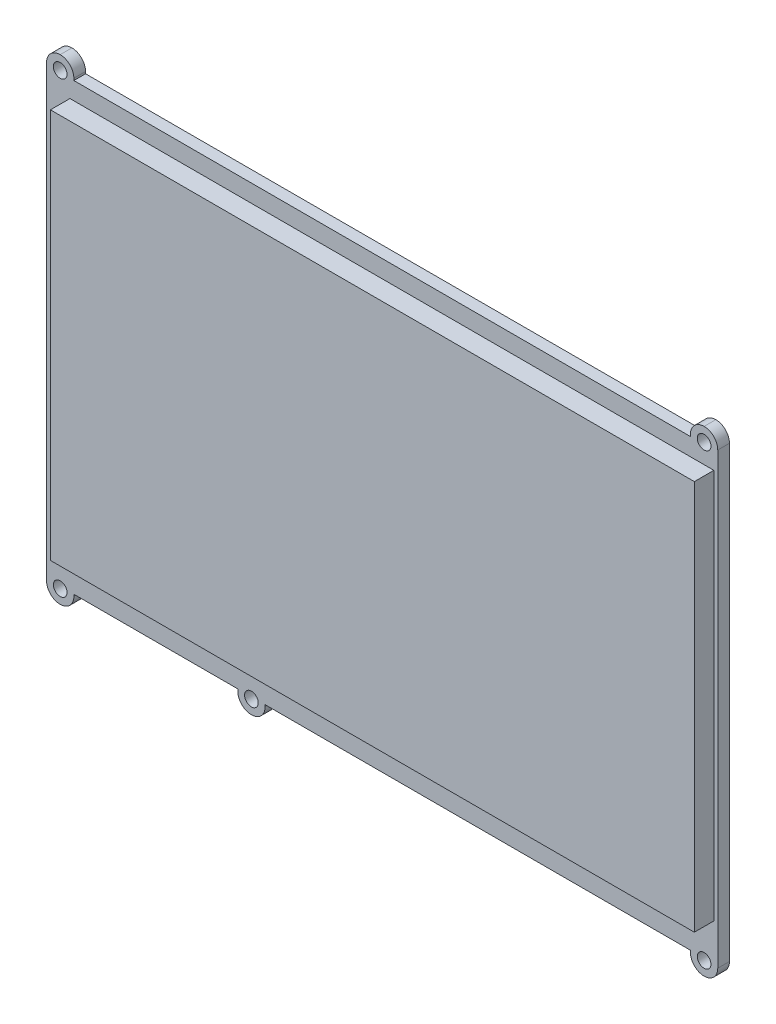
ISO-10303-21;
HEADER;
FILE_DESCRIPTION(('STEP AP214'),'2;1');
FILE_NAME('part.step','',(''),(''),'','','');
FILE_SCHEMA(('AUTOMOTIVE_DESIGN { 1 0 10303 214 1 1 1 1 }'));
ENDSEC;
DATA;
#1=APPLICATION_CONTEXT('core data for automotive mechanical design processes');
#2=APPLICATION_PROTOCOL_DEFINITION('international standard','automotive_design',2000,#1);
#3=PRODUCT_CONTEXT('',#1,'mechanical');
#4=PRODUCT('Part','Part','',(#3));
#5=PRODUCT_RELATED_PRODUCT_CATEGORY('part','',(#4));
#6=PRODUCT_DEFINITION_FORMATION('','',#4);
#7=PRODUCT_DEFINITION_CONTEXT('part definition',#1,'design');
#8=PRODUCT_DEFINITION('design','',#6,#7);
#9=PRODUCT_DEFINITION_SHAPE('','',#8);
#10=(LENGTH_UNIT() NAMED_UNIT(*) SI_UNIT(.MILLI.,.METRE.));
#11=(NAMED_UNIT(*) PLANE_ANGLE_UNIT() SI_UNIT($,.RADIAN.));
#12=(NAMED_UNIT(*) SI_UNIT($,.STERADIAN.) SOLID_ANGLE_UNIT());
#13=UNCERTAINTY_MEASURE_WITH_UNIT(LENGTH_MEASURE(1.E-05),#10,'distance_accuracy_value','');
#14=(GEOMETRIC_REPRESENTATION_CONTEXT(3) GLOBAL_UNCERTAINTY_ASSIGNED_CONTEXT((#13)) GLOBAL_UNIT_ASSIGNED_CONTEXT((#10,
#11,#12)) REPRESENTATION_CONTEXT('',''));
#15=CARTESIAN_POINT('',(0.,0.,0.));
#16=DIRECTION('',(0.,0.,1.));
#17=DIRECTION('',(1.,0.,0.));
#18=AXIS2_PLACEMENT_3D('',#15,#16,#17);
#19=CARTESIAN_POINT('',(5.99999999999999,13.5,8.));
#20=DIRECTION('',(0.,1.,0.));
#21=DIRECTION('',(-1.,0.,0.));
#22=AXIS2_PLACEMENT_3D('',#19,#20,#21);
#23=PLANE('',#22);
#24=DIRECTION('',(0.,0.,-1.));
#25=VECTOR('',#24,1.);
#26=CARTESIAN_POINT('',(5.99999999999999,13.5,8.));
#27=LINE('',#26,#25);
#28=CARTESIAN_POINT('',(5.99999999999999,13.5,8.));
#29=VERTEX_POINT('',#28);
#30=CARTESIAN_POINT('',(5.99999999999999,13.5,3.));
#31=VERTEX_POINT('',#30);
#32=EDGE_CURVE('E221',#29,#31,#27,.T.);
#33=ORIENTED_EDGE('',*,*,#32,.T.);
#34=DIRECTION('',(1.,0.,0.));
#35=VECTOR('',#34,1.);
#36=CARTESIAN_POINT('',(5.99999999999999,13.5,3.));
#37=LINE('',#36,#35);
#38=CARTESIAN_POINT('',(171.,13.5,3.));
#39=VERTEX_POINT('',#38);
#40=EDGE_CURVE('E206',#31,#39,#37,.T.);
#41=ORIENTED_EDGE('',*,*,#40,.T.);
#42=DIRECTION('',(0.,0.,-1.));
#43=VECTOR('',#42,1.);
#44=CARTESIAN_POINT('',(171.,13.5,8.));
#45=LINE('',#44,#43);
#46=CARTESIAN_POINT('',(171.,13.5,8.));
#47=VERTEX_POINT('',#46);
#48=EDGE_CURVE('E218',#47,#39,#45,.T.);
#49=ORIENTED_EDGE('',*,*,#48,.F.);
#50=DIRECTION('',(1.,0.,0.));
#51=VECTOR('',#50,1.);
#52=CARTESIAN_POINT('',(5.99999999999999,13.5,8.));
#53=LINE('',#52,#51);
#54=EDGE_CURVE('E381',#29,#47,#53,.T.);
#55=ORIENTED_EDGE('',*,*,#54,.F.);
#56=EDGE_LOOP('',(#33,#41,#49,#55));
#57=FACE_BOUND('',#56,.T.);
#58=ADVANCED_FACE('F34',(#57),#23,.F.);
#59=CARTESIAN_POINT('',(171.,113.5,8.));
#60=DIRECTION('',(1.,0.,0.));
#61=DIRECTION('',(0.,1.,0.));
#62=AXIS2_PLACEMENT_3D('',#59,#60,#61);
#63=PLANE('',#62);
#64=DIRECTION('',(0.,1.,0.));
#65=VECTOR('',#64,1.);
#66=CARTESIAN_POINT('',(171.,113.5,3.));
#67=LINE('',#66,#65);
#68=CARTESIAN_POINT('',(171.,113.5,3.));
#69=VERTEX_POINT('',#68);
#70=EDGE_CURVE('E202',#39,#69,#67,.T.);
#71=ORIENTED_EDGE('',*,*,#70,.T.);
#72=DIRECTION('',(0.,0.,-1.));
#73=VECTOR('',#72,1.);
#74=CARTESIAN_POINT('',(171.,113.5,8.));
#75=LINE('',#74,#73);
#76=CARTESIAN_POINT('',(171.,113.5,8.));
#77=VERTEX_POINT('',#76);
#78=EDGE_CURVE('E228',#77,#69,#75,.T.);
#79=ORIENTED_EDGE('',*,*,#78,.F.);
#80=DIRECTION('',(0.,-1.,0.));
#81=VECTOR('',#80,1.);
#82=CARTESIAN_POINT('',(171.,113.5,8.));
#83=LINE('',#82,#81);
#84=EDGE_CURVE('E226',#77,#47,#83,.T.);
#85=ORIENTED_EDGE('',*,*,#84,.T.);
#86=ORIENTED_EDGE('',*,*,#48,.T.);
#87=EDGE_LOOP('',(#71,#79,#85,#86));
#88=FACE_BOUND('',#87,.T.);
#89=ADVANCED_FACE('F224',(#88),#63,.T.);
#90=CARTESIAN_POINT('',(5.99999999999998,113.5,8.));
#91=DIRECTION('',(0.,1.,0.));
#92=DIRECTION('',(0.,0.,1.));
#93=AXIS2_PLACEMENT_3D('',#90,#91,#92);
#94=PLANE('',#93);
#95=DIRECTION('',(-1.,0.,0.));
#96=VECTOR('',#95,1.);
#97=CARTESIAN_POINT('',(5.99999999999998,113.5,3.));
#98=LINE('',#97,#96);
#99=CARTESIAN_POINT('',(5.99999999999998,113.5,3.));
#100=VERTEX_POINT('',#99);
#101=EDGE_CURVE('E209',#69,#100,#98,.T.);
#102=ORIENTED_EDGE('',*,*,#101,.T.);
#103=DIRECTION('',(0.,0.,-1.));
#104=VECTOR('',#103,1.);
#105=CARTESIAN_POINT('',(5.99999999999998,113.5,8.));
#106=LINE('',#105,#104);
#107=CARTESIAN_POINT('',(5.99999999999998,113.5,8.));
#108=VERTEX_POINT('',#107);
#109=EDGE_CURVE('E233',#108,#100,#106,.T.);
#110=ORIENTED_EDGE('',*,*,#109,.F.);
#111=DIRECTION('',(1.,0.,0.));
#112=VECTOR('',#111,1.);
#113=CARTESIAN_POINT('',(5.99999999999998,113.5,8.));
#114=LINE('',#113,#112);
#115=EDGE_CURVE('E384',#108,#77,#114,.T.);
#116=ORIENTED_EDGE('',*,*,#115,.T.);
#117=ORIENTED_EDGE('',*,*,#78,.T.);
#118=EDGE_LOOP('',(#102,#110,#116,#117));
#119=FACE_BOUND('',#118,.T.);
#120=ADVANCED_FACE('F395',(#119),#94,.T.);
#121=CARTESIAN_POINT('',(5.99999999999998,113.5,8.));
#122=DIRECTION('',(1.,0.,0.));
#123=DIRECTION('',(0.,1.,0.));
#124=AXIS2_PLACEMENT_3D('',#121,#122,#123);
#125=PLANE('',#124);
#126=ORIENTED_EDGE('',*,*,#109,.T.);
#127=DIRECTION('',(0.,-1.,0.));
#128=VECTOR('',#127,1.);
#129=CARTESIAN_POINT('',(5.99999999999998,113.5,3.));
#130=LINE('',#129,#128);
#131=EDGE_CURVE('E222',#100,#31,#130,.T.);
#132=ORIENTED_EDGE('',*,*,#131,.T.);
#133=ORIENTED_EDGE('',*,*,#32,.F.);
#134=DIRECTION('',(0.,-1.,0.));
#135=VECTOR('',#134,1.);
#136=CARTESIAN_POINT('',(5.99999999999998,113.5,8.));
#137=LINE('',#136,#135);
#138=EDGE_CURVE('E387',#108,#29,#137,.T.);
#139=ORIENTED_EDGE('',*,*,#138,.F.);
#140=EDGE_LOOP('',(#126,#132,#133,#139));
#141=FACE_BOUND('',#140,.T.);
#142=ADVANCED_FACE('F392',(#141),#125,.F.);
#143=CARTESIAN_POINT('',(0.,0.,8.));
#144=DIRECTION('',(0.,0.,-1.));
#145=DIRECTION('',(-1.,0.,0.));
#146=AXIS2_PLACEMENT_3D('',#143,#144,#145);
#147=PLANE('',#146);
#148=ORIENTED_EDGE('',*,*,#54,.T.);
#149=ORIENTED_EDGE('',*,*,#84,.F.);
#150=ORIENTED_EDGE('',*,*,#115,.F.);
#151=ORIENTED_EDGE('',*,*,#138,.T.);
#152=EDGE_LOOP('',(#148,#149,#150,#151));
#153=FACE_BOUND('',#152,.T.);
#154=ADVANCED_FACE('F682',(#153),#147,.F.);
#155=CARTESIAN_POINT('',(0.,0.,3.));
#156=DIRECTION('',(0.,0.,1.));
#157=DIRECTION('',(1.,0.,0.));
#158=AXIS2_PLACEMENT_3D('',#155,#156,#157);
#159=PLANE('',#158);
#160=CARTESIAN_POINT('',(52.5000000000012,3.5,3.));
#161=DIRECTION('',(0.,0.,1.));
#162=DIRECTION('',(1.,0.,0.));
#163=AXIS2_PLACEMENT_3D('',#160,#161,#162);
#164=CIRCLE('',#163,1.75);
#165=CARTESIAN_POINT('',(54.2500000000012,3.5,3.));
#166=VERTEX_POINT('',#165);
#167=EDGE_CURVE('E781',#166,#166,#164,.T.);
#168=ORIENTED_EDGE('',*,*,#167,.F.);
#169=EDGE_LOOP('',(#168));
#170=FACE_BOUND('',#169,.T.);
#171=CARTESIAN_POINT('',(168.500000000001,3.5,3.));
#172=DIRECTION('',(0.,0.,1.));
#173=DIRECTION('',(1.,0.,0.));
#174=AXIS2_PLACEMENT_3D('',#171,#172,#173);
#175=CIRCLE('',#174,1.75000000000001);
#176=CARTESIAN_POINT('',(170.250000000001,3.5,3.));
#177=VERTEX_POINT('',#176);
#178=EDGE_CURVE('E785',#177,#177,#175,.T.);
#179=ORIENTED_EDGE('',*,*,#178,.F.);
#180=EDGE_LOOP('',(#179));
#181=FACE_BOUND('',#180,.T.);
#182=CARTESIAN_POINT('',(3.5,118.5,3.));
#183=DIRECTION('',(0.,0.,1.));
#184=DIRECTION('',(1.,0.,0.));
#185=AXIS2_PLACEMENT_3D('',#182,#183,#184);
#186=CIRCLE('',#185,1.75);
#187=CARTESIAN_POINT('',(5.25,118.5,3.));
#188=VERTEX_POINT('',#187);
#189=EDGE_CURVE('E788',#188,#188,#186,.T.);
#190=ORIENTED_EDGE('',*,*,#189,.F.);
#191=EDGE_LOOP('',(#190));
#192=FACE_BOUND('',#191,.T.);
#193=DIRECTION('',(0.,-1.,0.));
#194=VECTOR('',#193,1.);
#195=CARTESIAN_POINT('',(165.,0.,3.));
#196=LINE('',#195,#194);
#197=CARTESIAN_POINT('',(165.,4.,3.));
#198=VERTEX_POINT('',#197);
#199=CARTESIAN_POINT('',(165.,3.5,3.));
#200=VERTEX_POINT('',#199);
#201=EDGE_CURVE('E333',#198,#200,#196,.T.);
#202=ORIENTED_EDGE('',*,*,#201,.T.);
#203=CARTESIAN_POINT('',(168.5,3.5,3.));
#204=DIRECTION('',(0.,0.,1.));
#205=DIRECTION('',(1.,0.,0.));
#206=AXIS2_PLACEMENT_3D('',#203,#204,#205);
#207=CIRCLE('',#206,3.5);
#208=CARTESIAN_POINT('',(168.5,0.,3.));
#209=VERTEX_POINT('',#208);
#210=EDGE_CURVE('E273',#200,#209,#207,.T.);
#211=ORIENTED_EDGE('',*,*,#210,.T.);
#212=CARTESIAN_POINT('',(168.5,3.5,3.));
#213=DIRECTION('',(0.,0.,1.));
#214=DIRECTION('',(1.,0.,0.));
#215=AXIS2_PLACEMENT_3D('',#212,#213,#214);
#216=CIRCLE('',#215,3.5);
#217=CARTESIAN_POINT('',(172.,3.5,3.));
#218=VERTEX_POINT('',#217);
#219=EDGE_CURVE('E271',#209,#218,#216,.T.);
#220=ORIENTED_EDGE('',*,*,#219,.T.);
#221=DIRECTION('',(0.,1.,0.));
#222=VECTOR('',#221,1.);
#223=CARTESIAN_POINT('',(172.,0.,3.));
#224=LINE('',#223,#222);
#225=CARTESIAN_POINT('',(172.,118.5,3.));
#226=VERTEX_POINT('',#225);
#227=EDGE_CURVE('E329',#218,#226,#224,.T.);
#228=ORIENTED_EDGE('',*,*,#227,.T.);
#229=CARTESIAN_POINT('',(168.5,118.5,3.));
#230=DIRECTION('',(0.,0.,1.));
#231=DIRECTION('',(1.,0.,0.));
#232=AXIS2_PLACEMENT_3D('',#229,#230,#231);
#233=CIRCLE('',#232,3.5);
#234=CARTESIAN_POINT('',(168.5,122.,3.));
#235=VERTEX_POINT('',#234);
#236=EDGE_CURVE('E258',#226,#235,#233,.T.);
#237=ORIENTED_EDGE('',*,*,#236,.T.);
#238=CARTESIAN_POINT('',(168.5,118.5,3.));
#239=DIRECTION('',(0.,0.,1.));
#240=DIRECTION('',(1.,0.,0.));
#241=AXIS2_PLACEMENT_3D('',#238,#239,#240);
#242=CIRCLE('',#241,3.5);
#243=CARTESIAN_POINT('',(165.,118.5,3.));
#244=VERTEX_POINT('',#243);
#245=EDGE_CURVE('E256',#235,#244,#242,.T.);
#246=ORIENTED_EDGE('',*,*,#245,.T.);
#247=DIRECTION('',(0.,-1.,0.));
#248=VECTOR('',#247,1.);
#249=CARTESIAN_POINT('',(165.,118.,3.));
#250=LINE('',#249,#248);
#251=CARTESIAN_POINT('',(165.,118.,3.));
#252=VERTEX_POINT('',#251);
#253=EDGE_CURVE('E319',#244,#252,#250,.T.);
#254=ORIENTED_EDGE('',*,*,#253,.T.);
#255=DIRECTION('',(-1.,0.,0.));
#256=VECTOR('',#255,1.);
#257=CARTESIAN_POINT('',(7.,118.,3.));
#258=LINE('',#257,#256);
#259=CARTESIAN_POINT('',(7.,118.,3.));
#260=VERTEX_POINT('',#259);
#261=EDGE_CURVE('E328',#252,#260,#258,.T.);
#262=ORIENTED_EDGE('',*,*,#261,.T.);
#263=DIRECTION('',(0.,1.,0.));
#264=VECTOR('',#263,1.);
#265=CARTESIAN_POINT('',(7.,122.,3.));
#266=LINE('',#265,#264);
#267=CARTESIAN_POINT('',(7.,118.5,3.));
#268=VERTEX_POINT('',#267);
#269=EDGE_CURVE('E331',#260,#268,#266,.T.);
#270=ORIENTED_EDGE('',*,*,#269,.T.);
#271=CARTESIAN_POINT('',(3.5,118.5,3.));
#272=DIRECTION('',(0.,0.,1.));
#273=DIRECTION('',(1.,0.,0.));
#274=AXIS2_PLACEMENT_3D('',#271,#272,#273);
#275=CIRCLE('',#274,3.5);
#276=CARTESIAN_POINT('',(3.5,122.,3.));
#277=VERTEX_POINT('',#276);
#278=EDGE_CURVE('E51',#268,#277,#275,.T.);
#279=ORIENTED_EDGE('',*,*,#278,.T.);
#280=CARTESIAN_POINT('',(3.5,118.5,3.));
#281=DIRECTION('',(0.,0.,1.));
#282=DIRECTION('',(1.,0.,0.));
#283=AXIS2_PLACEMENT_3D('',#280,#281,#282);
#284=CIRCLE('',#283,3.5);
#285=CARTESIAN_POINT('',(0.,118.5,3.));
#286=VERTEX_POINT('',#285);
#287=EDGE_CURVE('E261',#277,#286,#284,.T.);
#288=ORIENTED_EDGE('',*,*,#287,.T.);
#289=DIRECTION('',(0.,-1.,0.));
#290=VECTOR('',#289,1.);
#291=CARTESIAN_POINT('',(0.,0.,3.));
#292=LINE('',#291,#290);
#293=CARTESIAN_POINT('',(0.,3.5,3.));
#294=VERTEX_POINT('',#293);
#295=EDGE_CURVE('E365',#286,#294,#292,.T.);
#296=ORIENTED_EDGE('',*,*,#295,.T.);
#297=CARTESIAN_POINT('',(3.5,3.5,3.));
#298=DIRECTION('',(0.,0.,1.));
#299=DIRECTION('',(1.,0.,0.));
#300=AXIS2_PLACEMENT_3D('',#297,#298,#299);
#301=CIRCLE('',#300,3.5);
#302=CARTESIAN_POINT('',(3.5,0.,3.));
#303=VERTEX_POINT('',#302);
#304=EDGE_CURVE('E265',#294,#303,#301,.T.);
#305=ORIENTED_EDGE('',*,*,#304,.T.);
#306=CARTESIAN_POINT('',(3.5,3.5,3.));
#307=DIRECTION('',(0.,0.,1.));
#308=DIRECTION('',(1.,0.,0.));
#309=AXIS2_PLACEMENT_3D('',#306,#307,#308);
#310=CIRCLE('',#309,3.5);
#311=CARTESIAN_POINT('',(7.,3.5,3.));
#312=VERTEX_POINT('',#311);
#313=EDGE_CURVE('E263',#303,#312,#310,.T.);
#314=ORIENTED_EDGE('',*,*,#313,.T.);
#315=DIRECTION('',(0.,1.,0.));
#316=VECTOR('',#315,1.);
#317=CARTESIAN_POINT('',(7.,0.,3.));
#318=LINE('',#317,#316);
#319=CARTESIAN_POINT('',(7.,4.,3.));
#320=VERTEX_POINT('',#319);
#321=EDGE_CURVE('E400',#312,#320,#318,.T.);
#322=ORIENTED_EDGE('',*,*,#321,.T.);
#323=DIRECTION('',(1.,0.,0.));
#324=VECTOR('',#323,1.);
#325=CARTESIAN_POINT('',(7.,4.,3.));
#326=LINE('',#325,#324);
#327=CARTESIAN_POINT('',(49.0000000000012,4.,3.));
#328=VERTEX_POINT('',#327);
#329=EDGE_CURVE('E402',#320,#328,#326,.T.);
#330=ORIENTED_EDGE('',*,*,#329,.T.);
#331=DIRECTION('',(0.,-1.,0.));
#332=VECTOR('',#331,1.);
#333=CARTESIAN_POINT('',(49.0000000000012,4.,3.));
#334=LINE('',#333,#332);
#335=CARTESIAN_POINT('',(49.0000000000012,3.5,3.));
#336=VERTEX_POINT('',#335);
#337=EDGE_CURVE('E404',#328,#336,#334,.T.);
#338=ORIENTED_EDGE('',*,*,#337,.T.);
#339=CARTESIAN_POINT('',(52.5000000000012,3.5,3.));
#340=DIRECTION('',(0.,0.,1.));
#341=DIRECTION('',(1.,0.,0.));
#342=AXIS2_PLACEMENT_3D('',#339,#340,#341);
#343=CIRCLE('',#342,3.5);
#344=CARTESIAN_POINT('',(52.5000000000012,0.,3.));
#345=VERTEX_POINT('',#344);
#346=EDGE_CURVE('E267',#336,#345,#343,.T.);
#347=ORIENTED_EDGE('',*,*,#346,.T.);
#348=CARTESIAN_POINT('',(52.5000000000012,3.5,3.));
#349=DIRECTION('',(0.,0.,1.));
#350=DIRECTION('',(1.,0.,0.));
#351=AXIS2_PLACEMENT_3D('',#348,#349,#350);
#352=CIRCLE('',#351,3.5);
#353=CARTESIAN_POINT('',(56.0000000000012,3.5,3.));
#354=VERTEX_POINT('',#353);
#355=EDGE_CURVE('E269',#345,#354,#352,.T.);
#356=ORIENTED_EDGE('',*,*,#355,.T.);
#357=DIRECTION('',(0.,1.,0.));
#358=VECTOR('',#357,1.);
#359=CARTESIAN_POINT('',(56.0000000000012,4.,3.));
#360=LINE('',#359,#358);
#361=CARTESIAN_POINT('',(56.0000000000012,4.,3.));
#362=VERTEX_POINT('',#361);
#363=EDGE_CURVE('E407',#354,#362,#360,.T.);
#364=ORIENTED_EDGE('',*,*,#363,.T.);
#365=DIRECTION('',(1.,0.,0.));
#366=VECTOR('',#365,1.);
#367=CARTESIAN_POINT('',(56.0000000000012,4.,3.));
#368=LINE('',#367,#366);
#369=EDGE_CURVE('E409',#362,#198,#368,.T.);
#370=ORIENTED_EDGE('',*,*,#369,.T.);
#371=EDGE_LOOP('',(#202,#211,#220,#228,#237,#246,#254,#262,#270,#279,#288,#296,#305,#314,#322,
#330,#338,#347,#356,#364,#370));
#372=FACE_BOUND('',#371,.T.);
#373=ORIENTED_EDGE('',*,*,#40,.F.);
#374=ORIENTED_EDGE('',*,*,#131,.F.);
#375=ORIENTED_EDGE('',*,*,#101,.F.);
#376=ORIENTED_EDGE('',*,*,#70,.F.);
#377=EDGE_LOOP('',(#373,#374,#375,#376));
#378=FACE_BOUND('',#377,.T.);
#379=CARTESIAN_POINT('',(168.5,118.5,3.));
#380=DIRECTION('',(0.,0.,1.));
#381=DIRECTION('',(1.,0.,0.));
#382=AXIS2_PLACEMENT_3D('',#379,#380,#381);
#383=CIRCLE('',#382,1.75000000000001);
#384=CARTESIAN_POINT('',(170.25,118.5,3.));
#385=VERTEX_POINT('',#384);
#386=EDGE_CURVE('E793',#385,#385,#383,.T.);
#387=ORIENTED_EDGE('',*,*,#386,.F.);
#388=EDGE_LOOP('',(#387));
#389=FACE_BOUND('',#388,.T.);
#390=CARTESIAN_POINT('',(3.5000000000012,3.5,3.));
#391=DIRECTION('',(0.,0.,1.));
#392=DIRECTION('',(1.,0.,0.));
#393=AXIS2_PLACEMENT_3D('',#390,#391,#392);
#394=CIRCLE('',#393,1.75);
#395=CARTESIAN_POINT('',(5.25000000000121,3.5,3.));
#396=VERTEX_POINT('',#395);
#397=EDGE_CURVE('E804',#396,#396,#394,.T.);
#398=ORIENTED_EDGE('',*,*,#397,.F.);
#399=EDGE_LOOP('',(#398));
#400=FACE_BOUND('',#399,.T.);
#401=CARTESIAN_POINT('',(3.5000000000012,61.5,3.));
#402=DIRECTION('',(0.,0.,1.));
#403=DIRECTION('',(1.,0.,0.));
#404=AXIS2_PLACEMENT_3D('',#401,#402,#403);
#405=CIRCLE('',#404,1.74275220443837);
#406=CARTESIAN_POINT('',(5.24275220443957,61.5,3.));
#407=VERTEX_POINT('',#406);
#408=EDGE_CURVE('E814',#407,#407,#405,.T.);
#409=ORIENTED_EDGE('',*,*,#408,.F.);
#410=EDGE_LOOP('',(#409));
#411=FACE_BOUND('',#410,.T.);
#412=ADVANCED_FACE('F204',(#170,#181,#192,#372,#378,#389,#400,#411),#159,.T.);
#413=CARTESIAN_POINT('',(0.,0.,3.));
#414=DIRECTION('',(1.,0.,0.));
#415=DIRECTION('',(0.,0.,-1.));
#416=AXIS2_PLACEMENT_3D('',#413,#414,#415);
#417=PLANE('',#416);
#418=DIRECTION('',(0.,-1.,0.));
#419=VECTOR('',#418,1.);
#420=CARTESIAN_POINT('',(0.,0.,0.));
#421=LINE('',#420,#419);
#422=CARTESIAN_POINT('',(0.,118.5,0.));
#423=VERTEX_POINT('',#422);
#424=CARTESIAN_POINT('',(0.,3.5,0.));
#425=VERTEX_POINT('',#424);
#426=EDGE_CURVE('E339',#423,#425,#421,.T.);
#427=ORIENTED_EDGE('',*,*,#426,.T.);
#428=DIRECTION('',(0.,0.,-1.));
#429=VECTOR('',#428,1.);
#430=CARTESIAN_POINT('',(0.,3.5,3.));
#431=LINE('',#430,#429);
#432=EDGE_CURVE('E288',#425,#294,#431,.F.);
#433=ORIENTED_EDGE('',*,*,#432,.T.);
#434=ORIENTED_EDGE('',*,*,#295,.F.);
#435=DIRECTION('',(0.,0.,-1.));
#436=VECTOR('',#435,1.);
#437=CARTESIAN_POINT('',(0.,118.5,3.));
#438=LINE('',#437,#436);
#439=EDGE_CURVE('E285',#286,#423,#438,.T.);
#440=ORIENTED_EDGE('',*,*,#439,.T.);
#441=EDGE_LOOP('',(#427,#433,#434,#440));
#442=FACE_BOUND('',#441,.T.);
#443=ADVANCED_FACE('F445',(#442),#417,.F.);
#444=CARTESIAN_POINT('',(7.,0.,3.));
#445=DIRECTION('',(-1.,0.,0.));
#446=DIRECTION('',(0.,0.,1.));
#447=AXIS2_PLACEMENT_3D('',#444,#445,#446);
#448=PLANE('',#447);
#449=ORIENTED_EDGE('',*,*,#321,.F.);
#450=DIRECTION('',(0.,0.,-1.));
#451=VECTOR('',#450,1.);
#452=CARTESIAN_POINT('',(7.,3.5,3.));
#453=LINE('',#452,#451);
#454=CARTESIAN_POINT('',(7.,3.5,0.));
#455=VERTEX_POINT('',#454);
#456=EDGE_CURVE('E291',#312,#455,#453,.T.);
#457=ORIENTED_EDGE('',*,*,#456,.T.);
#458=DIRECTION('',(0.,1.,0.));
#459=VECTOR('',#458,1.);
#460=CARTESIAN_POINT('',(7.,0.,0.));
#461=LINE('',#460,#459);
#462=CARTESIAN_POINT('',(7.,4.,0.));
#463=VERTEX_POINT('',#462);
#464=EDGE_CURVE('E342',#455,#463,#461,.T.);
#465=ORIENTED_EDGE('',*,*,#464,.T.);
#466=DIRECTION('',(0.,0.,-1.));
#467=VECTOR('',#466,1.);
#468=CARTESIAN_POINT('',(7.,4.,3.));
#469=LINE('',#468,#467);
#470=EDGE_CURVE('E378',#320,#463,#469,.T.);
#471=ORIENTED_EDGE('',*,*,#470,.F.);
#472=EDGE_LOOP('',(#449,#457,#465,#471));
#473=FACE_BOUND('',#472,.T.);
#474=ADVANCED_FACE('F460',(#473),#448,.F.);
#475=CARTESIAN_POINT('',(7.,4.,3.));
#476=DIRECTION('',(0.,1.,0.));
#477=DIRECTION('',(0.,0.,1.));
#478=AXIS2_PLACEMENT_3D('',#475,#476,#477);
#479=PLANE('',#478);
#480=DIRECTION('',(1.,0.,0.));
#481=VECTOR('',#480,1.);
#482=CARTESIAN_POINT('',(7.,4.,0.));
#483=LINE('',#482,#481);
#484=CARTESIAN_POINT('',(49.0000000000012,4.,0.));
#485=VERTEX_POINT('',#484);
#486=EDGE_CURVE('E344',#463,#485,#483,.T.);
#487=ORIENTED_EDGE('',*,*,#486,.T.);
#488=DIRECTION('',(0.,0.,-1.));
#489=VECTOR('',#488,1.);
#490=CARTESIAN_POINT('',(49.0000000000012,4.,3.));
#491=LINE('',#490,#489);
#492=EDGE_CURVE('E375',#328,#485,#491,.T.);
#493=ORIENTED_EDGE('',*,*,#492,.F.);
#494=ORIENTED_EDGE('',*,*,#329,.F.);
#495=ORIENTED_EDGE('',*,*,#470,.T.);
#496=EDGE_LOOP('',(#487,#493,#494,#495));
#497=FACE_BOUND('',#496,.T.);
#498=ADVANCED_FACE('F466',(#497),#479,.F.);
#499=CARTESIAN_POINT('',(49.0000000000012,4.,3.));
#500=DIRECTION('',(1.,0.,0.));
#501=DIRECTION('',(0.,0.,-1.));
#502=AXIS2_PLACEMENT_3D('',#499,#500,#501);
#503=PLANE('',#502);
#504=DIRECTION('',(0.,-1.,0.));
#505=VECTOR('',#504,1.);
#506=CARTESIAN_POINT('',(49.0000000000012,4.,0.));
#507=LINE('',#506,#505);
#508=CARTESIAN_POINT('',(49.0000000000012,3.5,0.));
#509=VERTEX_POINT('',#508);
#510=EDGE_CURVE('E346',#485,#509,#507,.T.);
#511=ORIENTED_EDGE('',*,*,#510,.T.);
#512=DIRECTION('',(0.,0.,-1.));
#513=VECTOR('',#512,1.);
#514=CARTESIAN_POINT('',(49.0000000000012,3.5,3.));
#515=LINE('',#514,#513);
#516=EDGE_CURVE('E283',#509,#336,#515,.F.);
#517=ORIENTED_EDGE('',*,*,#516,.T.);
#518=ORIENTED_EDGE('',*,*,#337,.F.);
#519=ORIENTED_EDGE('',*,*,#492,.T.);
#520=EDGE_LOOP('',(#511,#517,#518,#519));
#521=FACE_BOUND('',#520,.T.);
#522=ADVANCED_FACE('F470',(#521),#503,.F.);
#523=CARTESIAN_POINT('',(56.0000000000012,4.,3.));
#524=DIRECTION('',(-1.,0.,0.));
#525=DIRECTION('',(0.,0.,1.));
#526=AXIS2_PLACEMENT_3D('',#523,#524,#525);
#527=PLANE('',#526);
#528=ORIENTED_EDGE('',*,*,#363,.F.);
#529=DIRECTION('',(0.,0.,-1.));
#530=VECTOR('',#529,1.);
#531=CARTESIAN_POINT('',(56.0000000000012,3.5,3.));
#532=LINE('',#531,#530);
#533=CARTESIAN_POINT('',(56.0000000000012,3.5,0.));
#534=VERTEX_POINT('',#533);
#535=EDGE_CURVE('E227',#354,#534,#532,.T.);
#536=ORIENTED_EDGE('',*,*,#535,.T.);
#537=DIRECTION('',(0.,1.,0.));
#538=VECTOR('',#537,1.);
#539=CARTESIAN_POINT('',(56.0000000000012,4.,0.));
#540=LINE('',#539,#538);
#541=CARTESIAN_POINT('',(56.0000000000012,4.,0.));
#542=VERTEX_POINT('',#541);
#543=EDGE_CURVE('E349',#534,#542,#540,.T.);
#544=ORIENTED_EDGE('',*,*,#543,.T.);
#545=DIRECTION('',(0.,0.,-1.));
#546=VECTOR('',#545,1.);
#547=CARTESIAN_POINT('',(56.0000000000012,4.,3.));
#548=LINE('',#547,#546);
#549=EDGE_CURVE('E372',#362,#542,#548,.T.);
#550=ORIENTED_EDGE('',*,*,#549,.F.);
#551=EDGE_LOOP('',(#528,#536,#544,#550));
#552=FACE_BOUND('',#551,.T.);
#553=ADVANCED_FACE('F484',(#552),#527,.F.);
#554=CARTESIAN_POINT('',(56.0000000000012,4.,3.));
#555=DIRECTION('',(0.,1.,0.));
#556=DIRECTION('',(0.,0.,1.));
#557=AXIS2_PLACEMENT_3D('',#554,#555,#556);
#558=PLANE('',#557);
#559=DIRECTION('',(1.,0.,0.));
#560=VECTOR('',#559,1.);
#561=CARTESIAN_POINT('',(56.0000000000012,4.,0.));
#562=LINE('',#561,#560);
#563=CARTESIAN_POINT('',(165.,4.,0.));
#564=VERTEX_POINT('',#563);
#565=EDGE_CURVE('E351',#542,#564,#562,.T.);
#566=ORIENTED_EDGE('',*,*,#565,.T.);
#567=DIRECTION('',(0.,0.,-1.));
#568=VECTOR('',#567,1.);
#569=CARTESIAN_POINT('',(165.,4.,3.));
#570=LINE('',#569,#568);
#571=EDGE_CURVE('E369',#198,#564,#570,.T.);
#572=ORIENTED_EDGE('',*,*,#571,.F.);
#573=ORIENTED_EDGE('',*,*,#369,.F.);
#574=ORIENTED_EDGE('',*,*,#549,.T.);
#575=EDGE_LOOP('',(#566,#572,#573,#574));
#576=FACE_BOUND('',#575,.T.);
#577=ADVANCED_FACE('F488',(#576),#558,.F.);
#578=CARTESIAN_POINT('',(165.,0.,3.));
#579=DIRECTION('',(1.,0.,0.));
#580=DIRECTION('',(0.,0.,-1.));
#581=AXIS2_PLACEMENT_3D('',#578,#579,#580);
#582=PLANE('',#581);
#583=DIRECTION('',(0.,-1.,0.));
#584=VECTOR('',#583,1.);
#585=CARTESIAN_POINT('',(165.,0.,0.));
#586=LINE('',#585,#584);
#587=CARTESIAN_POINT('',(165.,3.5,0.));
#588=VERTEX_POINT('',#587);
#589=EDGE_CURVE('E353',#564,#588,#586,.T.);
#590=ORIENTED_EDGE('',*,*,#589,.T.);
#591=DIRECTION('',(0.,0.,-1.));
#592=VECTOR('',#591,1.);
#593=CARTESIAN_POINT('',(165.,3.5,3.));
#594=LINE('',#593,#592);
#595=EDGE_CURVE('E275',#588,#200,#594,.F.);
#596=ORIENTED_EDGE('',*,*,#595,.T.);
#597=ORIENTED_EDGE('',*,*,#201,.F.);
#598=ORIENTED_EDGE('',*,*,#571,.T.);
#599=EDGE_LOOP('',(#590,#596,#597,#598));
#600=FACE_BOUND('',#599,.T.);
#601=ADVANCED_FACE('F415',(#600),#582,.F.);
#602=CARTESIAN_POINT('',(172.,0.,3.));
#603=DIRECTION('',(-1.,0.,0.));
#604=DIRECTION('',(0.,0.,1.));
#605=AXIS2_PLACEMENT_3D('',#602,#603,#604);
#606=PLANE('',#605);
#607=ORIENTED_EDGE('',*,*,#227,.F.);
#608=DIRECTION('',(0.,0.,-1.));
#609=VECTOR('',#608,1.);
#610=CARTESIAN_POINT('',(172.,3.5,3.));
#611=LINE('',#610,#609);
#612=CARTESIAN_POINT('',(172.,3.5,0.));
#613=VERTEX_POINT('',#612);
#614=EDGE_CURVE('E281',#218,#613,#611,.T.);
#615=ORIENTED_EDGE('',*,*,#614,.T.);
#616=DIRECTION('',(0.,1.,0.));
#617=VECTOR('',#616,1.);
#618=CARTESIAN_POINT('',(172.,0.,0.));
#619=LINE('',#618,#617);
#620=CARTESIAN_POINT('',(172.,118.5,0.));
#621=VERTEX_POINT('',#620);
#622=EDGE_CURVE('E356',#613,#621,#619,.T.);
#623=ORIENTED_EDGE('',*,*,#622,.T.);
#624=DIRECTION('',(0.,0.,-1.));
#625=VECTOR('',#624,1.);
#626=CARTESIAN_POINT('',(172.,118.5,3.));
#627=LINE('',#626,#625);
#628=EDGE_CURVE('E278',#621,#226,#627,.F.);
#629=ORIENTED_EDGE('',*,*,#628,.T.);
#630=EDGE_LOOP('',(#607,#615,#623,#629));
#631=FACE_BOUND('',#630,.T.);
#632=ADVANCED_FACE('F428',(#631),#606,.F.);
#633=CARTESIAN_POINT('',(165.,118.,3.));
#634=DIRECTION('',(1.,0.,0.));
#635=DIRECTION('',(0.,0.,-1.));
#636=AXIS2_PLACEMENT_3D('',#633,#634,#635);
#637=PLANE('',#636);
#638=ORIENTED_EDGE('',*,*,#253,.F.);
#639=DIRECTION('',(0.,0.,-1.));
#640=VECTOR('',#639,1.);
#641=CARTESIAN_POINT('',(165.,118.5,3.));
#642=LINE('',#641,#640);
#643=CARTESIAN_POINT('',(165.,118.5,0.));
#644=VERTEX_POINT('',#643);
#645=EDGE_CURVE('E11',#244,#644,#642,.T.);
#646=ORIENTED_EDGE('',*,*,#645,.T.);
#647=DIRECTION('',(0.,-1.,0.));
#648=VECTOR('',#647,1.);
#649=CARTESIAN_POINT('',(165.,118.,0.));
#650=LINE('',#649,#648);
#651=CARTESIAN_POINT('',(165.,118.,0.));
#652=VERTEX_POINT('',#651);
#653=EDGE_CURVE('E359',#644,#652,#650,.T.);
#654=ORIENTED_EDGE('',*,*,#653,.T.);
#655=DIRECTION('',(0.,0.,-1.));
#656=VECTOR('',#655,1.);
#657=CARTESIAN_POINT('',(165.,118.,3.));
#658=LINE('',#657,#656);
#659=EDGE_CURVE('E326',#252,#652,#658,.T.);
#660=ORIENTED_EDGE('',*,*,#659,.F.);
#661=EDGE_LOOP('',(#638,#646,#654,#660));
#662=FACE_BOUND('',#661,.T.);
#663=ADVANCED_FACE('F323',(#662),#637,.F.);
#664=CARTESIAN_POINT('',(7.,118.,3.));
#665=DIRECTION('',(0.,-1.,0.));
#666=DIRECTION('',(0.,0.,-1.));
#667=AXIS2_PLACEMENT_3D('',#664,#665,#666);
#668=PLANE('',#667);
#669=DIRECTION('',(-1.,0.,0.));
#670=VECTOR('',#669,1.);
#671=CARTESIAN_POINT('',(7.,118.,0.));
#672=LINE('',#671,#670);
#673=CARTESIAN_POINT('',(7.,118.,0.));
#674=VERTEX_POINT('',#673);
#675=EDGE_CURVE('E361',#652,#674,#672,.T.);
#676=ORIENTED_EDGE('',*,*,#675,.T.);
#677=DIRECTION('',(0.,0.,-1.));
#678=VECTOR('',#677,1.);
#679=CARTESIAN_POINT('',(7.,118.,3.));
#680=LINE('',#679,#678);
#681=EDGE_CURVE('E338',#260,#674,#680,.T.);
#682=ORIENTED_EDGE('',*,*,#681,.F.);
#683=ORIENTED_EDGE('',*,*,#261,.F.);
#684=ORIENTED_EDGE('',*,*,#659,.T.);
#685=EDGE_LOOP('',(#676,#682,#683,#684));
#686=FACE_BOUND('',#685,.T.);
#687=ADVANCED_FACE('F436',(#686),#668,.F.);
#688=CARTESIAN_POINT('',(7.,122.,3.));
#689=DIRECTION('',(-1.,0.,0.));
#690=DIRECTION('',(0.,-1.,0.));
#691=AXIS2_PLACEMENT_3D('',#688,#689,#690);
#692=PLANE('',#691);
#693=DIRECTION('',(0.,1.,0.));
#694=VECTOR('',#693,1.);
#695=CARTESIAN_POINT('',(7.,122.,0.));
#696=LINE('',#695,#694);
#697=CARTESIAN_POINT('',(7.,118.5,0.));
#698=VERTEX_POINT('',#697);
#699=EDGE_CURVE('E363',#674,#698,#696,.T.);
#700=ORIENTED_EDGE('',*,*,#699,.T.);
#701=DIRECTION('',(0.,0.,-1.));
#702=VECTOR('',#701,1.);
#703=CARTESIAN_POINT('',(7.,118.5,3.));
#704=LINE('',#703,#702);
#705=EDGE_CURVE('E43',#698,#268,#704,.F.);
#706=ORIENTED_EDGE('',*,*,#705,.T.);
#707=ORIENTED_EDGE('',*,*,#269,.F.);
#708=ORIENTED_EDGE('',*,*,#681,.T.);
#709=EDGE_LOOP('',(#700,#706,#707,#708));
#710=FACE_BOUND('',#709,.T.);
#711=ADVANCED_FACE('F613',(#710),#692,.F.);
#712=CARTESIAN_POINT('',(3.5,118.5,3.));
#713=DIRECTION('',(0.,0.,-1.));
#714=DIRECTION('',(-1.,0.,0.));
#715=AXIS2_PLACEMENT_3D('',#712,#713,#714);
#716=CYLINDRICAL_SURFACE('',#715,1.75);
#717=ORIENTED_EDGE('',*,*,#189,.T.);
#718=EDGE_LOOP('',(#717));
#719=FACE_BOUND('',#718,.T.);
#720=CARTESIAN_POINT('',(3.5,118.5,0.));
#721=DIRECTION('',(0.,0.,1.));
#722=DIRECTION('',(1.,0.,0.));
#723=AXIS2_PLACEMENT_3D('',#720,#721,#722);
#724=CIRCLE('',#723,1.75);
#725=CARTESIAN_POINT('',(5.25,118.5,0.));
#726=VERTEX_POINT('',#725);
#727=EDGE_CURVE('E789',#726,#726,#724,.T.);
#728=ORIENTED_EDGE('',*,*,#727,.F.);
#729=EDGE_LOOP('',(#728));
#730=FACE_BOUND('',#729,.T.);
#731=ADVANCED_FACE('F605',(#719,#730),#716,.F.);
#732=CARTESIAN_POINT('',(168.5,118.5,3.));
#733=DIRECTION('',(0.,0.,-1.));
#734=DIRECTION('',(-1.,0.,0.));
#735=AXIS2_PLACEMENT_3D('',#732,#733,#734);
#736=CYLINDRICAL_SURFACE('',#735,1.75000000000001);
#737=ORIENTED_EDGE('',*,*,#386,.T.);
#738=EDGE_LOOP('',(#737));
#739=FACE_BOUND('',#738,.T.);
#740=CARTESIAN_POINT('',(168.5,118.5,0.));
#741=DIRECTION('',(0.,0.,1.));
#742=DIRECTION('',(1.,0.,0.));
#743=AXIS2_PLACEMENT_3D('',#740,#741,#742);
#744=CIRCLE('',#743,1.75000000000001);
#745=CARTESIAN_POINT('',(170.25,118.5,0.));
#746=VERTEX_POINT('',#745);
#747=EDGE_CURVE('E796',#746,#746,#744,.T.);
#748=ORIENTED_EDGE('',*,*,#747,.F.);
#749=EDGE_LOOP('',(#748));
#750=FACE_BOUND('',#749,.T.);
#751=ADVANCED_FACE('F597',(#739,#750),#736,.F.);
#752=CARTESIAN_POINT('',(168.500000000001,3.5,3.));
#753=DIRECTION('',(0.,0.,-1.));
#754=DIRECTION('',(-1.,0.,0.));
#755=AXIS2_PLACEMENT_3D('',#752,#753,#754);
#756=CYLINDRICAL_SURFACE('',#755,1.75000000000001);
#757=ORIENTED_EDGE('',*,*,#178,.T.);
#758=EDGE_LOOP('',(#757));
#759=FACE_BOUND('',#758,.T.);
#760=CARTESIAN_POINT('',(168.500000000001,3.5,0.));
#761=DIRECTION('',(0.,0.,1.));
#762=DIRECTION('',(1.,0.,0.));
#763=AXIS2_PLACEMENT_3D('',#760,#761,#762);
#764=CIRCLE('',#763,1.75000000000001);
#765=CARTESIAN_POINT('',(170.250000000001,3.5,0.));
#766=VERTEX_POINT('',#765);
#767=EDGE_CURVE('E801',#766,#766,#764,.T.);
#768=ORIENTED_EDGE('',*,*,#767,.F.);
#769=EDGE_LOOP('',(#768));
#770=FACE_BOUND('',#769,.T.);
#771=ADVANCED_FACE('F589',(#759,#770),#756,.F.);
#772=CARTESIAN_POINT('',(3.5000000000012,3.5,3.));
#773=DIRECTION('',(0.,0.,-1.));
#774=DIRECTION('',(-1.,0.,0.));
#775=AXIS2_PLACEMENT_3D('',#772,#773,#774);
#776=CYLINDRICAL_SURFACE('',#775,1.75);
#777=ORIENTED_EDGE('',*,*,#397,.T.);
#778=EDGE_LOOP('',(#777));
#779=FACE_BOUND('',#778,.T.);
#780=CARTESIAN_POINT('',(3.5000000000012,3.5,0.));
#781=DIRECTION('',(0.,0.,1.));
#782=DIRECTION('',(1.,0.,0.));
#783=AXIS2_PLACEMENT_3D('',#780,#781,#782);
#784=CIRCLE('',#783,1.75);
#785=CARTESIAN_POINT('',(5.25000000000121,3.5,0.));
#786=VERTEX_POINT('',#785);
#787=EDGE_CURVE('E806',#786,#786,#784,.T.);
#788=ORIENTED_EDGE('',*,*,#787,.F.);
#789=EDGE_LOOP('',(#788));
#790=FACE_BOUND('',#789,.T.);
#791=ADVANCED_FACE('F581',(#779,#790),#776,.F.);
#792=CARTESIAN_POINT('',(52.5000000000012,3.5,3.));
#793=DIRECTION('',(0.,0.,-1.));
#794=DIRECTION('',(-1.,0.,0.));
#795=AXIS2_PLACEMENT_3D('',#792,#793,#794);
#796=CYLINDRICAL_SURFACE('',#795,1.75);
#797=ORIENTED_EDGE('',*,*,#167,.T.);
#798=EDGE_LOOP('',(#797));
#799=FACE_BOUND('',#798,.T.);
#800=CARTESIAN_POINT('',(52.5000000000012,3.5,0.));
#801=DIRECTION('',(0.,0.,1.));
#802=DIRECTION('',(1.,0.,0.));
#803=AXIS2_PLACEMENT_3D('',#800,#801,#802);
#804=CIRCLE('',#803,1.75);
#805=CARTESIAN_POINT('',(54.2500000000012,3.5,0.));
#806=VERTEX_POINT('',#805);
#807=EDGE_CURVE('E811',#806,#806,#804,.T.);
#808=ORIENTED_EDGE('',*,*,#807,.F.);
#809=EDGE_LOOP('',(#808));
#810=FACE_BOUND('',#809,.T.);
#811=ADVANCED_FACE('F572',(#799,#810),#796,.F.);
#812=CARTESIAN_POINT('',(3.5000000000012,61.5,3.));
#813=DIRECTION('',(0.,0.,-1.));
#814=DIRECTION('',(-1.,0.,0.));
#815=AXIS2_PLACEMENT_3D('',#812,#813,#814);
#816=CYLINDRICAL_SURFACE('',#815,1.74275220443837);
#817=ORIENTED_EDGE('',*,*,#408,.T.);
#818=EDGE_LOOP('',(#817));
#819=FACE_BOUND('',#818,.T.);
#820=CARTESIAN_POINT('',(3.5000000000012,61.5,0.));
#821=DIRECTION('',(0.,0.,1.));
#822=DIRECTION('',(1.,0.,0.));
#823=AXIS2_PLACEMENT_3D('',#820,#821,#822);
#824=CIRCLE('',#823,1.74275220443837);
#825=CARTESIAN_POINT('',(5.24275220443957,61.5,0.));
#826=VERTEX_POINT('',#825);
#827=EDGE_CURVE('E297',#826,#826,#824,.T.);
#828=ORIENTED_EDGE('',*,*,#827,.F.);
#829=EDGE_LOOP('',(#828));
#830=FACE_BOUND('',#829,.T.);
#831=ADVANCED_FACE('F564',(#819,#830),#816,.F.);
#832=CARTESIAN_POINT('',(0.,0.,0.));
#833=DIRECTION('',(0.,0.,-1.));
#834=DIRECTION('',(-1.,0.,0.));
#835=AXIS2_PLACEMENT_3D('',#832,#833,#834);
#836=PLANE('',#835);
#837=CARTESIAN_POINT('',(168.5,3.5,0.));
#838=DIRECTION('',(0.,0.,-1.));
#839=DIRECTION('',(-1.,0.,0.));
#840=AXIS2_PLACEMENT_3D('',#837,#838,#839);
#841=CIRCLE('',#840,3.5);
#842=CARTESIAN_POINT('',(168.5,0.,0.));
#843=VERTEX_POINT('',#842);
#844=EDGE_CURVE('E252',#613,#843,#841,.T.);
#845=ORIENTED_EDGE('',*,*,#844,.T.);
#846=CARTESIAN_POINT('',(168.5,3.5,0.));
#847=DIRECTION('',(0.,0.,-1.));
#848=DIRECTION('',(-1.,0.,0.));
#849=AXIS2_PLACEMENT_3D('',#846,#847,#848);
#850=CIRCLE('',#849,3.5);
#851=EDGE_CURVE('E254',#843,#588,#850,.T.);
#852=ORIENTED_EDGE('',*,*,#851,.T.);
#853=ORIENTED_EDGE('',*,*,#589,.F.);
#854=ORIENTED_EDGE('',*,*,#565,.F.);
#855=ORIENTED_EDGE('',*,*,#543,.F.);
#856=CARTESIAN_POINT('',(52.5000000000012,3.5,0.));
#857=DIRECTION('',(0.,0.,-1.));
#858=DIRECTION('',(-1.,0.,0.));
#859=AXIS2_PLACEMENT_3D('',#856,#857,#858);
#860=CIRCLE('',#859,3.5);
#861=CARTESIAN_POINT('',(52.5000000000012,0.,0.));
#862=VERTEX_POINT('',#861);
#863=EDGE_CURVE('E250',#534,#862,#860,.T.);
#864=ORIENTED_EDGE('',*,*,#863,.T.);
#865=CARTESIAN_POINT('',(52.5000000000012,3.5,0.));
#866=DIRECTION('',(0.,0.,-1.));
#867=DIRECTION('',(-1.,0.,0.));
#868=AXIS2_PLACEMENT_3D('',#865,#866,#867);
#869=CIRCLE('',#868,3.5);
#870=EDGE_CURVE('E248',#862,#509,#869,.T.);
#871=ORIENTED_EDGE('',*,*,#870,.T.);
#872=ORIENTED_EDGE('',*,*,#510,.F.);
#873=ORIENTED_EDGE('',*,*,#486,.F.);
#874=ORIENTED_EDGE('',*,*,#464,.F.);
#875=CARTESIAN_POINT('',(3.5,3.5,0.));
#876=DIRECTION('',(0.,0.,-1.));
#877=DIRECTION('',(-1.,0.,0.));
#878=AXIS2_PLACEMENT_3D('',#875,#876,#877);
#879=CIRCLE('',#878,3.5);
#880=CARTESIAN_POINT('',(3.5,0.,0.));
#881=VERTEX_POINT('',#880);
#882=EDGE_CURVE('E244',#455,#881,#879,.T.);
#883=ORIENTED_EDGE('',*,*,#882,.T.);
#884=CARTESIAN_POINT('',(3.5,3.5,0.));
#885=DIRECTION('',(0.,0.,-1.));
#886=DIRECTION('',(-1.,0.,0.));
#887=AXIS2_PLACEMENT_3D('',#884,#885,#886);
#888=CIRCLE('',#887,3.5);
#889=EDGE_CURVE('E246',#881,#425,#888,.T.);
#890=ORIENTED_EDGE('',*,*,#889,.T.);
#891=ORIENTED_EDGE('',*,*,#426,.F.);
#892=CARTESIAN_POINT('',(3.5,118.5,0.));
#893=DIRECTION('',(0.,0.,-1.));
#894=DIRECTION('',(-1.,0.,0.));
#895=AXIS2_PLACEMENT_3D('',#892,#893,#894);
#896=CIRCLE('',#895,3.5);
#897=CARTESIAN_POINT('',(3.5,122.,0.));
#898=VERTEX_POINT('',#897);
#899=EDGE_CURVE('E242',#423,#898,#896,.T.);
#900=ORIENTED_EDGE('',*,*,#899,.T.);
#901=CARTESIAN_POINT('',(3.5,118.5,0.));
#902=DIRECTION('',(0.,0.,-1.));
#903=DIRECTION('',(-1.,0.,0.));
#904=AXIS2_PLACEMENT_3D('',#901,#902,#903);
#905=CIRCLE('',#904,3.5);
#906=EDGE_CURVE('E240',#898,#698,#905,.T.);
#907=ORIENTED_EDGE('',*,*,#906,.T.);
#908=ORIENTED_EDGE('',*,*,#699,.F.);
#909=ORIENTED_EDGE('',*,*,#675,.F.);
#910=ORIENTED_EDGE('',*,*,#653,.F.);
#911=CARTESIAN_POINT('',(168.5,118.5,0.));
#912=DIRECTION('',(0.,0.,-1.));
#913=DIRECTION('',(-1.,0.,0.));
#914=AXIS2_PLACEMENT_3D('',#911,#912,#913);
#915=CIRCLE('',#914,3.5);
#916=CARTESIAN_POINT('',(168.5,122.,0.));
#917=VERTEX_POINT('',#916);
#918=EDGE_CURVE('E231',#644,#917,#915,.T.);
#919=ORIENTED_EDGE('',*,*,#918,.T.);
#920=CARTESIAN_POINT('',(168.5,118.5,0.));
#921=DIRECTION('',(0.,0.,-1.));
#922=DIRECTION('',(-1.,0.,0.));
#923=AXIS2_PLACEMENT_3D('',#920,#921,#922);
#924=CIRCLE('',#923,3.5);
#925=EDGE_CURVE('E238',#917,#621,#924,.T.);
#926=ORIENTED_EDGE('',*,*,#925,.T.);
#927=ORIENTED_EDGE('',*,*,#622,.F.);
#928=EDGE_LOOP('',(#845,#852,#853,#854,#855,#864,#871,#872,#873,#874,#883,#890,#891,#900,#907,
#908,#909,#910,#919,#926,#927));
#929=FACE_BOUND('',#928,.T.);
#930=ORIENTED_EDGE('',*,*,#727,.T.);
#931=EDGE_LOOP('',(#930));
#932=FACE_BOUND('',#931,.T.);
#933=ORIENTED_EDGE('',*,*,#747,.T.);
#934=EDGE_LOOP('',(#933));
#935=FACE_BOUND('',#934,.T.);
#936=ORIENTED_EDGE('',*,*,#767,.T.);
#937=EDGE_LOOP('',(#936));
#938=FACE_BOUND('',#937,.T.);
#939=ORIENTED_EDGE('',*,*,#787,.T.);
#940=EDGE_LOOP('',(#939));
#941=FACE_BOUND('',#940,.T.);
#942=ORIENTED_EDGE('',*,*,#807,.T.);
#943=EDGE_LOOP('',(#942));
#944=FACE_BOUND('',#943,.T.);
#945=ORIENTED_EDGE('',*,*,#827,.T.);
#946=EDGE_LOOP('',(#945));
#947=FACE_BOUND('',#946,.T.);
#948=ADVANCED_FACE('F431',(#929,#932,#935,#938,#941,#944,#947),#836,.T.);
#949=CARTESIAN_POINT('',(52.5000000000012,3.5,3.));
#950=DIRECTION('',(0.,0.,-1.));
#951=DIRECTION('',(-1.,0.,0.));
#952=AXIS2_PLACEMENT_3D('',#949,#950,#951);
#953=CYLINDRICAL_SURFACE('',#952,3.5);
#954=DIRECTION('',(0.,0.,-1.));
#955=VECTOR('',#954,1.);
#956=CARTESIAN_POINT('',(52.5000000000012,0.,3.));
#957=LINE('',#956,#955);
#958=EDGE_CURVE('E294',#345,#862,#957,.T.);
#959=ORIENTED_EDGE('',*,*,#958,.F.);
#960=ORIENTED_EDGE('',*,*,#346,.F.);
#961=ORIENTED_EDGE('',*,*,#516,.F.);
#962=ORIENTED_EDGE('',*,*,#870,.F.);
#963=EDGE_LOOP('',(#959,#960,#961,#962));
#964=FACE_BOUND('',#963,.T.);
#965=ADVANCED_FACE('F475',(#964),#953,.T.);
#966=CARTESIAN_POINT('',(52.5000000000012,3.5,3.));
#967=DIRECTION('',(0.,0.,-1.));
#968=DIRECTION('',(-1.,0.,0.));
#969=AXIS2_PLACEMENT_3D('',#966,#967,#968);
#970=CYLINDRICAL_SURFACE('',#969,3.5);
#971=ORIENTED_EDGE('',*,*,#355,.F.);
#972=ORIENTED_EDGE('',*,*,#958,.T.);
#973=ORIENTED_EDGE('',*,*,#863,.F.);
#974=ORIENTED_EDGE('',*,*,#535,.F.);
#975=EDGE_LOOP('',(#971,#972,#973,#974));
#976=FACE_BOUND('',#975,.T.);
#977=ADVANCED_FACE('F480',(#976),#970,.T.);
#978=CARTESIAN_POINT('',(168.5,3.5,3.));
#979=DIRECTION('',(0.,0.,-1.));
#980=DIRECTION('',(-1.,0.,0.));
#981=AXIS2_PLACEMENT_3D('',#978,#979,#980);
#982=CYLINDRICAL_SURFACE('',#981,3.5);
#983=ORIENTED_EDGE('',*,*,#614,.F.);
#984=ORIENTED_EDGE('',*,*,#219,.F.);
#985=DIRECTION('',(0.,0.,-1.));
#986=VECTOR('',#985,1.);
#987=CARTESIAN_POINT('',(168.5,0.,3.));
#988=LINE('',#987,#986);
#989=EDGE_CURVE('E298',#843,#209,#988,.F.);
#990=ORIENTED_EDGE('',*,*,#989,.F.);
#991=ORIENTED_EDGE('',*,*,#844,.F.);
#992=EDGE_LOOP('',(#983,#984,#990,#991));
#993=FACE_BOUND('',#992,.T.);
#994=ADVANCED_FACE('F425',(#993),#982,.T.);
#995=CARTESIAN_POINT('',(168.5,3.5,3.));
#996=DIRECTION('',(0.,0.,-1.));
#997=DIRECTION('',(-1.,0.,0.));
#998=AXIS2_PLACEMENT_3D('',#995,#996,#997);
#999=CYLINDRICAL_SURFACE('',#998,3.5);
#1000=ORIENTED_EDGE('',*,*,#210,.F.);
#1001=ORIENTED_EDGE('',*,*,#595,.F.);
#1002=ORIENTED_EDGE('',*,*,#851,.F.);
#1003=ORIENTED_EDGE('',*,*,#989,.T.);
#1004=EDGE_LOOP('',(#1000,#1001,#1002,#1003));
#1005=FACE_BOUND('',#1004,.T.);
#1006=ADVANCED_FACE('F420',(#1005),#999,.T.);
#1007=CARTESIAN_POINT('',(3.5,3.5,3.));
#1008=DIRECTION('',(0.,0.,-1.));
#1009=DIRECTION('',(-1.,0.,0.));
#1010=AXIS2_PLACEMENT_3D('',#1007,#1008,#1009);
#1011=CYLINDRICAL_SURFACE('',#1010,3.5);
#1012=ORIENTED_EDGE('',*,*,#456,.F.);
#1013=ORIENTED_EDGE('',*,*,#313,.F.);
#1014=DIRECTION('',(0.,0.,-1.));
#1015=VECTOR('',#1014,1.);
#1016=CARTESIAN_POINT('',(3.5,0.,3.));
#1017=LINE('',#1016,#1015);
#1018=EDGE_CURVE('E301',#881,#303,#1017,.F.);
#1019=ORIENTED_EDGE('',*,*,#1018,.F.);
#1020=ORIENTED_EDGE('',*,*,#882,.F.);
#1021=EDGE_LOOP('',(#1012,#1013,#1019,#1020));
#1022=FACE_BOUND('',#1021,.T.);
#1023=ADVANCED_FACE('F456',(#1022),#1011,.T.);
#1024=CARTESIAN_POINT('',(3.5,3.5,3.));
#1025=DIRECTION('',(0.,0.,-1.));
#1026=DIRECTION('',(-1.,0.,0.));
#1027=AXIS2_PLACEMENT_3D('',#1024,#1025,#1026);
#1028=CYLINDRICAL_SURFACE('',#1027,3.5);
#1029=ORIENTED_EDGE('',*,*,#304,.F.);
#1030=ORIENTED_EDGE('',*,*,#432,.F.);
#1031=ORIENTED_EDGE('',*,*,#889,.F.);
#1032=ORIENTED_EDGE('',*,*,#1018,.T.);
#1033=EDGE_LOOP('',(#1029,#1030,#1031,#1032));
#1034=FACE_BOUND('',#1033,.T.);
#1035=ADVANCED_FACE('F450',(#1034),#1028,.T.);
#1036=CARTESIAN_POINT('',(3.5,118.5,3.));
#1037=DIRECTION('',(0.,0.,-1.));
#1038=DIRECTION('',(-1.,0.,0.));
#1039=AXIS2_PLACEMENT_3D('',#1036,#1037,#1038);
#1040=CYLINDRICAL_SURFACE('',#1039,3.5);
#1041=DIRECTION('',(0.,0.,-1.));
#1042=VECTOR('',#1041,1.);
#1043=CARTESIAN_POINT('',(3.5,122.,3.));
#1044=LINE('',#1043,#1042);
#1045=EDGE_CURVE('E303',#277,#898,#1044,.T.);
#1046=ORIENTED_EDGE('',*,*,#1045,.F.);
#1047=ORIENTED_EDGE('',*,*,#278,.F.);
#1048=ORIENTED_EDGE('',*,*,#705,.F.);
#1049=ORIENTED_EDGE('',*,*,#906,.F.);
#1050=EDGE_LOOP('',(#1046,#1047,#1048,#1049));
#1051=FACE_BOUND('',#1050,.T.);
#1052=ADVANCED_FACE('F439',(#1051),#1040,.T.);
#1053=CARTESIAN_POINT('',(3.5,118.5,3.));
#1054=DIRECTION('',(0.,0.,-1.));
#1055=DIRECTION('',(-1.,0.,0.));
#1056=AXIS2_PLACEMENT_3D('',#1053,#1054,#1055);
#1057=CYLINDRICAL_SURFACE('',#1056,3.5);
#1058=ORIENTED_EDGE('',*,*,#287,.F.);
#1059=ORIENTED_EDGE('',*,*,#1045,.T.);
#1060=ORIENTED_EDGE('',*,*,#899,.F.);
#1061=ORIENTED_EDGE('',*,*,#439,.F.);
#1062=EDGE_LOOP('',(#1058,#1059,#1060,#1061));
#1063=FACE_BOUND('',#1062,.T.);
#1064=ADVANCED_FACE('F442',(#1063),#1057,.T.);
#1065=CARTESIAN_POINT('',(168.5,118.5,3.));
#1066=DIRECTION('',(0.,0.,-1.));
#1067=DIRECTION('',(-1.,0.,0.));
#1068=AXIS2_PLACEMENT_3D('',#1065,#1066,#1067);
#1069=CYLINDRICAL_SURFACE('',#1068,3.5);
#1070=ORIENTED_EDGE('',*,*,#645,.F.);
#1071=ORIENTED_EDGE('',*,*,#245,.F.);
#1072=DIRECTION('',(0.,0.,-1.));
#1073=VECTOR('',#1072,1.);
#1074=CARTESIAN_POINT('',(168.5,122.,3.));
#1075=LINE('',#1074,#1073);
#1076=EDGE_CURVE('E38',#917,#235,#1075,.F.);
#1077=ORIENTED_EDGE('',*,*,#1076,.F.);
#1078=ORIENTED_EDGE('',*,*,#918,.F.);
#1079=EDGE_LOOP('',(#1070,#1071,#1077,#1078));
#1080=FACE_BOUND('',#1079,.T.);
#1081=ADVANCED_FACE('F36',(#1080),#1069,.T.);
#1082=CARTESIAN_POINT('',(168.5,118.5,3.));
#1083=DIRECTION('',(0.,0.,-1.));
#1084=DIRECTION('',(-1.,0.,0.));
#1085=AXIS2_PLACEMENT_3D('',#1082,#1083,#1084);
#1086=CYLINDRICAL_SURFACE('',#1085,3.5);
#1087=ORIENTED_EDGE('',*,*,#236,.F.);
#1088=ORIENTED_EDGE('',*,*,#628,.F.);
#1089=ORIENTED_EDGE('',*,*,#925,.F.);
#1090=ORIENTED_EDGE('',*,*,#1076,.T.);
#1091=EDGE_LOOP('',(#1087,#1088,#1089,#1090));
#1092=FACE_BOUND('',#1091,.T.);
#1093=ADVANCED_FACE('F311',(#1092),#1086,.T.);
#1094=CLOSED_SHELL('',(#58,#89,#120,#142,#154,#412,#443,#474,#498,#522,#553,#577,#601,#632,#663,
#687,#711,#731,#751,#771,#791,#811,#831,#948,#965,#977,#994,#1006,#1023,#1035,#1052,#1064,#1081,#1093));
#1095=MANIFOLD_SOLID_BREP('B2',#1094);
#1096=ADVANCED_BREP_SHAPE_REPRESENTATION('',(#18,#1095),#14);
#1097=SHAPE_DEFINITION_REPRESENTATION(#9,#1096);
ENDSEC;
END-ISO-10303-21;
